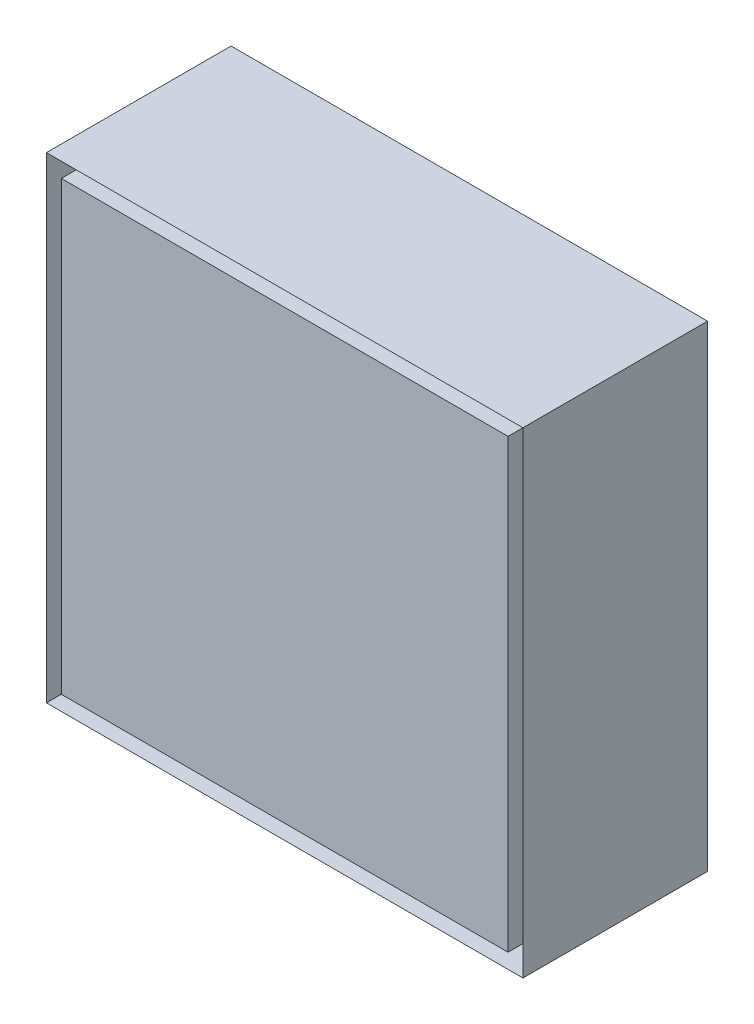
ISO-10303-21;
HEADER;
FILE_DESCRIPTION(('STEP AP214'),'2;1');
FILE_NAME('part.step','',(''),(''),'','','');
FILE_SCHEMA(('AUTOMOTIVE_DESIGN { 1 0 10303 214 1 1 1 1 }'));
ENDSEC;
DATA;
#1=APPLICATION_CONTEXT('core data for automotive mechanical design processes');
#2=APPLICATION_PROTOCOL_DEFINITION('international standard','automotive_design',2000,#1);
#3=PRODUCT_CONTEXT('',#1,'mechanical');
#4=PRODUCT('Part','Part','',(#3));
#5=PRODUCT_RELATED_PRODUCT_CATEGORY('part','',(#4));
#6=PRODUCT_DEFINITION_FORMATION('','',#4);
#7=PRODUCT_DEFINITION_CONTEXT('part definition',#1,'design');
#8=PRODUCT_DEFINITION('design','',#6,#7);
#9=PRODUCT_DEFINITION_SHAPE('','',#8);
#10=(LENGTH_UNIT() NAMED_UNIT(*) SI_UNIT(.MILLI.,.METRE.));
#11=(NAMED_UNIT(*) PLANE_ANGLE_UNIT() SI_UNIT($,.RADIAN.));
#12=(NAMED_UNIT(*) SI_UNIT($,.STERADIAN.) SOLID_ANGLE_UNIT());
#13=UNCERTAINTY_MEASURE_WITH_UNIT(LENGTH_MEASURE(1.E-05),#10,'distance_accuracy_value','');
#14=(GEOMETRIC_REPRESENTATION_CONTEXT(3) GLOBAL_UNCERTAINTY_ASSIGNED_CONTEXT((#13)) GLOBAL_UNIT_ASSIGNED_CONTEXT((#10,
#11,#12)) REPRESENTATION_CONTEXT('',''));
#15=CARTESIAN_POINT('',(0.,0.,0.));
#16=DIRECTION('',(0.,0.,1.));
#17=DIRECTION('',(1.,0.,0.));
#18=AXIS2_PLACEMENT_3D('',#15,#16,#17);
#19=CARTESIAN_POINT('',(3.16,-3.16,0.0762));
#20=DIRECTION('',(1.,0.,0.));
#21=DIRECTION('',(0.,1.,0.));
#22=AXIS2_PLACEMENT_3D('',#19,#20,#21);
#23=PLANE('',#22);
#24=DIRECTION('',(0.,0.,1.));
#25=VECTOR('',#24,1.);
#26=CARTESIAN_POINT('',(3.16,3.16,0.0862));
#27=LINE('',#26,#25);
#28=CARTESIAN_POINT('',(3.16,3.16,0.0862));
#29=VERTEX_POINT('',#28);
#30=CARTESIAN_POINT('',(3.16,3.16,0.1262));
#31=VERTEX_POINT('',#30);
#32=EDGE_CURVE('P0_E11',#29,#31,#27,.T.);
#33=ORIENTED_EDGE('',*,*,#32,.T.);
#34=DIRECTION('',(0.,1.,0.));
#35=VECTOR('',#34,1.);
#36=CARTESIAN_POINT('',(3.16,-3.16,0.1262));
#37=LINE('',#36,#35);
#38=CARTESIAN_POINT('',(3.16,-3.16,0.1262));
#39=VERTEX_POINT('',#38);
#40=EDGE_CURVE('P0_E213',#39,#31,#37,.T.);
#41=ORIENTED_EDGE('',*,*,#40,.F.);
#42=DIRECTION('',(0.,0.,1.));
#43=VECTOR('',#42,1.);
#44=CARTESIAN_POINT('',(3.16,-3.16,0.0862));
#45=LINE('',#44,#43);
#46=CARTESIAN_POINT('',(3.16,-3.16,0.0862));
#47=VERTEX_POINT('',#46);
#48=EDGE_CURVE('P0_E277',#47,#39,#45,.T.);
#49=ORIENTED_EDGE('',*,*,#48,.F.);
#50=DIRECTION('',(0.,1.,0.));
#51=VECTOR('',#50,1.);
#52=CARTESIAN_POINT('',(3.16,-3.16,0.0862));
#53=LINE('',#52,#51);
#54=EDGE_CURVE('P0_E229',#47,#29,#53,.T.);
#55=ORIENTED_EDGE('',*,*,#54,.T.);
#56=EDGE_LOOP('',(#33,#41,#49,#55));
#57=FACE_BOUND('',#56,.T.);
#58=ADVANCED_FACE('P0_F18',(#57),#23,.T.);
#59=CARTESIAN_POINT('',(3.16,3.16,0.0762));
#60=DIRECTION('',(0.,1.,0.));
#61=DIRECTION('',(1.,0.,0.));
#62=AXIS2_PLACEMENT_3D('',#59,#60,#61);
#63=PLANE('',#62);
#64=DIRECTION('',(0.,0.,1.));
#65=VECTOR('',#64,1.);
#66=CARTESIAN_POINT('',(1.56,3.16,0.0862));
#67=LINE('',#66,#65);
#68=CARTESIAN_POINT('',(1.56,3.16,0.0862));
#69=VERTEX_POINT('',#68);
#70=CARTESIAN_POINT('',(1.56,3.16,0.1262));
#71=VERTEX_POINT('',#70);
#72=EDGE_CURVE('P0_E29',#69,#71,#67,.T.);
#73=ORIENTED_EDGE('',*,*,#72,.T.);
#74=DIRECTION('',(-1.,0.,0.));
#75=VECTOR('',#74,1.);
#76=CARTESIAN_POINT('',(3.16,3.16,0.1262));
#77=LINE('',#76,#75);
#78=EDGE_CURVE('P0_E194',#31,#71,#77,.T.);
#79=ORIENTED_EDGE('',*,*,#78,.F.);
#80=ORIENTED_EDGE('',*,*,#32,.F.);
#81=DIRECTION('',(-1.,0.,0.));
#82=VECTOR('',#81,1.);
#83=CARTESIAN_POINT('',(3.16,3.16,0.0862));
#84=LINE('',#83,#82);
#85=EDGE_CURVE('P0_E203',#29,#69,#84,.T.);
#86=ORIENTED_EDGE('',*,*,#85,.T.);
#87=EDGE_LOOP('',(#73,#79,#80,#86));
#88=FACE_BOUND('',#87,.T.);
#89=ADVANCED_FACE('P0_F466',(#88),#63,.T.);
#90=CARTESIAN_POINT('',(1.56,3.16,0.0762));
#91=DIRECTION('',(-1.,0.,0.));
#92=DIRECTION('',(0.,0.,1.));
#93=AXIS2_PLACEMENT_3D('',#90,#91,#92);
#94=PLANE('',#93);
#95=DIRECTION('',(0.,0.,1.));
#96=VECTOR('',#95,1.);
#97=CARTESIAN_POINT('',(1.56,-3.16,0.0862));
#98=LINE('',#97,#96);
#99=CARTESIAN_POINT('',(1.56,-3.16,0.0862));
#100=VERTEX_POINT('',#99);
#101=CARTESIAN_POINT('',(1.56,-3.16,0.1262));
#102=VERTEX_POINT('',#101);
#103=EDGE_CURVE('P0_E274',#100,#102,#98,.T.);
#104=ORIENTED_EDGE('',*,*,#103,.T.);
#105=DIRECTION('',(0.,-1.,0.));
#106=VECTOR('',#105,1.);
#107=CARTESIAN_POINT('',(1.56,3.16,0.1262));
#108=LINE('',#107,#106);
#109=EDGE_CURVE('P0_E190',#71,#102,#108,.T.);
#110=ORIENTED_EDGE('',*,*,#109,.F.);
#111=ORIENTED_EDGE('',*,*,#72,.F.);
#112=DIRECTION('',(0.,-1.,0.));
#113=VECTOR('',#112,1.);
#114=CARTESIAN_POINT('',(1.56,3.16,0.0862));
#115=LINE('',#114,#113);
#116=EDGE_CURVE('P0_E199',#69,#100,#115,.T.);
#117=ORIENTED_EDGE('',*,*,#116,.T.);
#118=EDGE_LOOP('',(#104,#110,#111,#117));
#119=FACE_BOUND('',#118,.T.);
#120=ADVANCED_FACE('P0_F461',(#119),#94,.T.);
#121=CARTESIAN_POINT('',(1.56,-3.16,0.0762));
#122=DIRECTION('',(0.,-1.,0.));
#123=DIRECTION('',(0.,0.,-1.));
#124=AXIS2_PLACEMENT_3D('',#121,#122,#123);
#125=PLANE('',#124);
#126=ORIENTED_EDGE('',*,*,#48,.T.);
#127=DIRECTION('',(1.,0.,0.));
#128=VECTOR('',#127,1.);
#129=CARTESIAN_POINT('',(1.56,-3.16,0.1262));
#130=LINE('',#129,#128);
#131=EDGE_CURVE('P0_E185',#102,#39,#130,.T.);
#132=ORIENTED_EDGE('',*,*,#131,.F.);
#133=ORIENTED_EDGE('',*,*,#103,.F.);
#134=DIRECTION('',(1.,0.,0.));
#135=VECTOR('',#134,1.);
#136=CARTESIAN_POINT('',(1.56,-3.16,0.0862));
#137=LINE('',#136,#135);
#138=EDGE_CURVE('P0_E233',#100,#47,#137,.T.);
#139=ORIENTED_EDGE('',*,*,#138,.T.);
#140=EDGE_LOOP('',(#126,#132,#133,#139));
#141=FACE_BOUND('',#140,.T.);
#142=ADVANCED_FACE('P0_F465',(#141),#125,.T.);
#143=CARTESIAN_POINT('',(-3.16,-3.16,0.0762));
#144=DIRECTION('',(0.,-1.,0.));
#145=DIRECTION('',(0.,0.,-1.));
#146=AXIS2_PLACEMENT_3D('',#143,#144,#145);
#147=PLANE('',#146);
#148=DIRECTION('',(0.,0.,1.));
#149=VECTOR('',#148,1.);
#150=CARTESIAN_POINT('',(-1.56,-3.16,0.0862));
#151=LINE('',#150,#149);
#152=CARTESIAN_POINT('',(-1.56,-3.16,0.0862));
#153=VERTEX_POINT('',#152);
#154=CARTESIAN_POINT('',(-1.56,-3.16,0.1262));
#155=VERTEX_POINT('',#154);
#156=EDGE_CURVE('P0_E180',#153,#155,#151,.T.);
#157=ORIENTED_EDGE('',*,*,#156,.T.);
#158=DIRECTION('',(1.,0.,0.));
#159=VECTOR('',#158,1.);
#160=CARTESIAN_POINT('',(-3.16,-3.16,0.1262));
#161=LINE('',#160,#159);
#162=CARTESIAN_POINT('',(-3.16,-3.16,0.1262));
#163=VERTEX_POINT('',#162);
#164=EDGE_CURVE('P0_E173',#163,#155,#161,.T.);
#165=ORIENTED_EDGE('',*,*,#164,.F.);
#166=DIRECTION('',(0.,0.,1.));
#167=VECTOR('',#166,1.);
#168=CARTESIAN_POINT('',(-3.16,-3.16,0.0862));
#169=LINE('',#168,#167);
#170=CARTESIAN_POINT('',(-3.16,-3.16,0.0862));
#171=VERTEX_POINT('',#170);
#172=EDGE_CURVE('P0_E273',#171,#163,#169,.T.);
#173=ORIENTED_EDGE('',*,*,#172,.F.);
#174=DIRECTION('',(1.,0.,0.));
#175=VECTOR('',#174,1.);
#176=CARTESIAN_POINT('',(-3.16,-3.16,0.0862));
#177=LINE('',#176,#175);
#178=EDGE_CURVE('P0_E209',#171,#153,#177,.T.);
#179=ORIENTED_EDGE('',*,*,#178,.T.);
#180=EDGE_LOOP('',(#157,#165,#173,#179));
#181=FACE_BOUND('',#180,.T.);
#182=ADVANCED_FACE('P0_F428',(#181),#147,.T.);
#183=CARTESIAN_POINT('',(-3.16,3.16,0.0762));
#184=DIRECTION('',(-1.,0.,0.));
#185=DIRECTION('',(0.,0.,1.));
#186=AXIS2_PLACEMENT_3D('',#183,#184,#185);
#187=PLANE('',#186);
#188=ORIENTED_EDGE('',*,*,#172,.T.);
#189=DIRECTION('',(0.,-1.,0.));
#190=VECTOR('',#189,1.);
#191=CARTESIAN_POINT('',(-3.16,3.16,0.1262));
#192=LINE('',#191,#190);
#193=CARTESIAN_POINT('',(-3.16,3.16,0.1262));
#194=VERTEX_POINT('',#193);
#195=EDGE_CURVE('P0_E169',#194,#163,#192,.T.);
#196=ORIENTED_EDGE('',*,*,#195,.F.);
#197=DIRECTION('',(0.,0.,1.));
#198=VECTOR('',#197,1.);
#199=CARTESIAN_POINT('',(-3.16,3.16,0.0862));
#200=LINE('',#199,#198);
#201=CARTESIAN_POINT('',(-3.16,3.16,0.0862));
#202=VERTEX_POINT('',#201);
#203=EDGE_CURVE('P0_E269',#202,#194,#200,.T.);
#204=ORIENTED_EDGE('',*,*,#203,.F.);
#205=DIRECTION('',(0.,-1.,0.));
#206=VECTOR('',#205,1.);
#207=CARTESIAN_POINT('',(-3.16,3.16,0.0862));
#208=LINE('',#207,#206);
#209=EDGE_CURVE('P0_E218',#202,#171,#208,.T.);
#210=ORIENTED_EDGE('',*,*,#209,.T.);
#211=EDGE_LOOP('',(#188,#196,#204,#210));
#212=FACE_BOUND('',#211,.T.);
#213=ADVANCED_FACE('P0_F420',(#212),#187,.T.);
#214=CARTESIAN_POINT('',(-1.56,3.16,0.0762));
#215=DIRECTION('',(0.,1.,0.));
#216=DIRECTION('',(1.,0.,0.));
#217=AXIS2_PLACEMENT_3D('',#214,#215,#216);
#218=PLANE('',#217);
#219=ORIENTED_EDGE('',*,*,#203,.T.);
#220=DIRECTION('',(-1.,0.,0.));
#221=VECTOR('',#220,1.);
#222=CARTESIAN_POINT('',(-1.56,3.16,0.1262));
#223=LINE('',#222,#221);
#224=CARTESIAN_POINT('',(-1.56,3.16,0.1262));
#225=VERTEX_POINT('',#224);
#226=EDGE_CURVE('P0_E174',#225,#194,#223,.T.);
#227=ORIENTED_EDGE('',*,*,#226,.F.);
#228=DIRECTION('',(0.,0.,1.));
#229=VECTOR('',#228,1.);
#230=CARTESIAN_POINT('',(-1.56,3.16,0.0862));
#231=LINE('',#230,#229);
#232=CARTESIAN_POINT('',(-1.56,3.16,0.0862));
#233=VERTEX_POINT('',#232);
#234=EDGE_CURVE('P0_E181',#233,#225,#231,.T.);
#235=ORIENTED_EDGE('',*,*,#234,.F.);
#236=DIRECTION('',(-1.,0.,0.));
#237=VECTOR('',#236,1.);
#238=CARTESIAN_POINT('',(-1.56,3.16,0.0862));
#239=LINE('',#238,#237);
#240=EDGE_CURVE('P0_E222',#233,#202,#239,.T.);
#241=ORIENTED_EDGE('',*,*,#240,.T.);
#242=EDGE_LOOP('',(#219,#227,#235,#241));
#243=FACE_BOUND('',#242,.T.);
#244=ADVANCED_FACE('P0_F353',(#243),#218,.T.);
#245=CARTESIAN_POINT('',(1.47,3.26,0.0762));
#246=DIRECTION('',(-1.,0.,0.));
#247=DIRECTION('',(0.,0.,1.));
#248=AXIS2_PLACEMENT_3D('',#245,#246,#247);
#249=PLANE('',#248);
#250=DIRECTION('',(0.,0.,1.));
#251=VECTOR('',#250,1.);
#252=CARTESIAN_POINT('',(1.47,-3.26,0.0762));
#253=LINE('',#252,#251);
#254=CARTESIAN_POINT('',(1.47,-3.26,0.0762));
#255=VERTEX_POINT('',#254);
#256=CARTESIAN_POINT('',(1.47,-3.26,0.0862));
#257=VERTEX_POINT('',#256);
#258=EDGE_CURVE('P0_E189',#255,#257,#253,.T.);
#259=ORIENTED_EDGE('',*,*,#258,.T.);
#260=DIRECTION('',(0.,-1.,0.));
#261=VECTOR('',#260,1.);
#262=CARTESIAN_POINT('',(1.47,3.26,0.0862));
#263=LINE('',#262,#261);
#264=CARTESIAN_POINT('',(1.47,3.26,0.0862));
#265=VERTEX_POINT('',#264);
#266=EDGE_CURVE('P0_E315',#265,#257,#263,.T.);
#267=ORIENTED_EDGE('',*,*,#266,.F.);
#268=DIRECTION('',(0.,0.,1.));
#269=VECTOR('',#268,1.);
#270=CARTESIAN_POINT('',(1.47,3.26,0.0762));
#271=LINE('',#270,#269);
#272=CARTESIAN_POINT('',(1.47,3.26,0.0762));
#273=VERTEX_POINT('',#272);
#274=EDGE_CURVE('P0_E197',#273,#265,#271,.T.);
#275=ORIENTED_EDGE('',*,*,#274,.F.);
#276=DIRECTION('',(0.,-1.,0.));
#277=VECTOR('',#276,1.);
#278=CARTESIAN_POINT('',(1.47,3.26,0.0762));
#279=LINE('',#278,#277);
#280=EDGE_CURVE('P0_E162',#273,#255,#279,.T.);
#281=ORIENTED_EDGE('',*,*,#280,.T.);
#282=EDGE_LOOP('',(#259,#267,#275,#281));
#283=FACE_BOUND('',#282,.T.);
#284=ADVANCED_FACE('P0_F441',(#283),#249,.T.);
#285=CARTESIAN_POINT('',(3.25,3.26,0.0762));
#286=DIRECTION('',(0.,1.,0.));
#287=DIRECTION('',(1.,0.,0.));
#288=AXIS2_PLACEMENT_3D('',#285,#286,#287);
#289=PLANE('',#288);
#290=ORIENTED_EDGE('',*,*,#274,.T.);
#291=DIRECTION('',(-1.,0.,0.));
#292=VECTOR('',#291,1.);
#293=CARTESIAN_POINT('',(3.25,3.26,0.0862));
#294=LINE('',#293,#292);
#295=CARTESIAN_POINT('',(3.25,3.26,0.0862));
#296=VERTEX_POINT('',#295);
#297=EDGE_CURVE('P0_E284',#296,#265,#294,.T.);
#298=ORIENTED_EDGE('',*,*,#297,.F.);
#299=DIRECTION('',(0.,0.,1.));
#300=VECTOR('',#299,1.);
#301=CARTESIAN_POINT('',(3.25,3.26,0.0762));
#302=LINE('',#301,#300);
#303=CARTESIAN_POINT('',(3.25,3.26,0.0762));
#304=VERTEX_POINT('',#303);
#305=EDGE_CURVE('P0_E43',#304,#296,#302,.T.);
#306=ORIENTED_EDGE('',*,*,#305,.F.);
#307=DIRECTION('',(-1.,0.,0.));
#308=VECTOR('',#307,1.);
#309=CARTESIAN_POINT('',(3.25,3.26,0.0762));
#310=LINE('',#309,#308);
#311=EDGE_CURVE('P0_E258',#304,#273,#310,.T.);
#312=ORIENTED_EDGE('',*,*,#311,.T.);
#313=EDGE_LOOP('',(#290,#298,#306,#312));
#314=FACE_BOUND('',#313,.T.);
#315=ADVANCED_FACE('P0_F20',(#314),#289,.T.);
#316=CARTESIAN_POINT('',(3.25,-3.26,0.0762));
#317=DIRECTION('',(1.,0.,0.));
#318=DIRECTION('',(0.,1.,0.));
#319=AXIS2_PLACEMENT_3D('',#316,#317,#318);
#320=PLANE('',#319);
#321=ORIENTED_EDGE('',*,*,#305,.T.);
#322=DIRECTION('',(0.,1.,0.));
#323=VECTOR('',#322,1.);
#324=CARTESIAN_POINT('',(3.25,-3.26,0.0862));
#325=LINE('',#324,#323);
#326=CARTESIAN_POINT('',(3.25,-3.26,0.0862));
#327=VERTEX_POINT('',#326);
#328=EDGE_CURVE('P0_E179',#327,#296,#325,.T.);
#329=ORIENTED_EDGE('',*,*,#328,.F.);
#330=DIRECTION('',(0.,0.,1.));
#331=VECTOR('',#330,1.);
#332=CARTESIAN_POINT('',(3.25,-3.26,0.0762));
#333=LINE('',#332,#331);
#334=CARTESIAN_POINT('',(3.25,-3.26,0.0762));
#335=VERTEX_POINT('',#334);
#336=EDGE_CURVE('P0_E265',#335,#327,#333,.T.);
#337=ORIENTED_EDGE('',*,*,#336,.F.);
#338=DIRECTION('',(0.,1.,0.));
#339=VECTOR('',#338,1.);
#340=CARTESIAN_POINT('',(3.25,-3.26,0.0762));
#341=LINE('',#340,#339);
#342=EDGE_CURVE('P0_E261',#335,#304,#341,.T.);
#343=ORIENTED_EDGE('',*,*,#342,.T.);
#344=EDGE_LOOP('',(#321,#329,#337,#343));
#345=FACE_BOUND('',#344,.T.);
#346=ADVANCED_FACE('P0_F440',(#345),#320,.T.);
#347=CARTESIAN_POINT('',(-1.47,-3.26,0.0762));
#348=DIRECTION('',(1.,0.,0.));
#349=DIRECTION('',(0.,1.,0.));
#350=AXIS2_PLACEMENT_3D('',#347,#348,#349);
#351=PLANE('',#350);
#352=DIRECTION('',(0.,0.,1.));
#353=VECTOR('',#352,1.);
#354=CARTESIAN_POINT('',(-1.47,3.26,0.0762));
#355=LINE('',#354,#353);
#356=CARTESIAN_POINT('',(-1.47,3.26,0.0762));
#357=VERTEX_POINT('',#356);
#358=CARTESIAN_POINT('',(-1.47,3.26,0.0862));
#359=VERTEX_POINT('',#358);
#360=EDGE_CURVE('P0_E198',#357,#359,#355,.T.);
#361=ORIENTED_EDGE('',*,*,#360,.T.);
#362=DIRECTION('',(0.,1.,0.));
#363=VECTOR('',#362,1.);
#364=CARTESIAN_POINT('',(-1.47,-3.26,0.0862));
#365=LINE('',#364,#363);
#366=CARTESIAN_POINT('',(-1.47,-3.26,0.0862));
#367=VERTEX_POINT('',#366);
#368=EDGE_CURVE('P0_E290',#367,#359,#365,.T.);
#369=ORIENTED_EDGE('',*,*,#368,.F.);
#370=DIRECTION('',(0.,0.,1.));
#371=VECTOR('',#370,1.);
#372=CARTESIAN_POINT('',(-1.47,-3.26,0.0762));
#373=LINE('',#372,#371);
#374=CARTESIAN_POINT('',(-1.47,-3.26,0.0762));
#375=VERTEX_POINT('',#374);
#376=EDGE_CURVE('P0_E246',#375,#367,#373,.T.);
#377=ORIENTED_EDGE('',*,*,#376,.F.);
#378=DIRECTION('',(0.,1.,0.));
#379=VECTOR('',#378,1.);
#380=CARTESIAN_POINT('',(-1.47,-3.26,0.0762));
#381=LINE('',#380,#379);
#382=EDGE_CURVE('P0_E320',#375,#357,#381,.T.);
#383=ORIENTED_EDGE('',*,*,#382,.T.);
#384=EDGE_LOOP('',(#361,#369,#377,#383));
#385=FACE_BOUND('',#384,.T.);
#386=ADVANCED_FACE('P0_F554',(#385),#351,.T.);
#387=CARTESIAN_POINT('',(-1.47,3.26,0.0762));
#388=DIRECTION('',(0.,1.,0.));
#389=DIRECTION('',(1.,0.,0.));
#390=AXIS2_PLACEMENT_3D('',#387,#388,#389);
#391=PLANE('',#390);
#392=DIRECTION('',(0.,0.,1.));
#393=VECTOR('',#392,1.);
#394=CARTESIAN_POINT('',(-3.25,3.26,0.0762));
#395=LINE('',#394,#393);
#396=CARTESIAN_POINT('',(-3.25,3.26,0.0762));
#397=VERTEX_POINT('',#396);
#398=CARTESIAN_POINT('',(-3.25,3.26,0.0862));
#399=VERTEX_POINT('',#398);
#400=EDGE_CURVE('P0_E245',#397,#399,#395,.T.);
#401=ORIENTED_EDGE('',*,*,#400,.T.);
#402=DIRECTION('',(-1.,0.,0.));
#403=VECTOR('',#402,1.);
#404=CARTESIAN_POINT('',(-1.47,3.26,0.0862));
#405=LINE('',#404,#403);
#406=EDGE_CURVE('P0_E296',#359,#399,#405,.T.);
#407=ORIENTED_EDGE('',*,*,#406,.F.);
#408=ORIENTED_EDGE('',*,*,#360,.F.);
#409=DIRECTION('',(-1.,0.,0.));
#410=VECTOR('',#409,1.);
#411=CARTESIAN_POINT('',(-1.47,3.26,0.0762));
#412=LINE('',#411,#410);
#413=EDGE_CURVE('P0_E167',#357,#397,#412,.T.);
#414=ORIENTED_EDGE('',*,*,#413,.T.);
#415=EDGE_LOOP('',(#401,#407,#408,#414));
#416=FACE_BOUND('',#415,.T.);
#417=ADVANCED_FACE('P0_F584',(#416),#391,.T.);
#418=CARTESIAN_POINT('',(-3.25,3.26,0.0762));
#419=DIRECTION('',(-1.,0.,0.));
#420=DIRECTION('',(0.,0.,1.));
#421=AXIS2_PLACEMENT_3D('',#418,#419,#420);
#422=PLANE('',#421);
#423=DIRECTION('',(0.,0.,1.));
#424=VECTOR('',#423,1.);
#425=CARTESIAN_POINT('',(-3.25,-3.26,0.0762));
#426=LINE('',#425,#424);
#427=CARTESIAN_POINT('',(-3.25,-3.26,0.0762));
#428=VERTEX_POINT('',#427);
#429=CARTESIAN_POINT('',(-3.25,-3.26,0.0862));
#430=VERTEX_POINT('',#429);
#431=EDGE_CURVE('P0_E241',#428,#430,#426,.T.);
#432=ORIENTED_EDGE('',*,*,#431,.T.);
#433=DIRECTION('',(0.,-1.,0.));
#434=VECTOR('',#433,1.);
#435=CARTESIAN_POINT('',(-3.25,3.26,0.0862));
#436=LINE('',#435,#434);
#437=EDGE_CURVE('P0_E22',#399,#430,#436,.T.);
#438=ORIENTED_EDGE('',*,*,#437,.F.);
#439=ORIENTED_EDGE('',*,*,#400,.F.);
#440=DIRECTION('',(0.,-1.,0.));
#441=VECTOR('',#440,1.);
#442=CARTESIAN_POINT('',(-3.25,3.26,0.0762));
#443=LINE('',#442,#441);
#444=EDGE_CURVE('P0_E164',#397,#428,#443,.T.);
#445=ORIENTED_EDGE('',*,*,#444,.T.);
#446=EDGE_LOOP('',(#432,#438,#439,#445));
#447=FACE_BOUND('',#446,.T.);
#448=ADVANCED_FACE('P0_F565',(#447),#422,.T.);
#449=CARTESIAN_POINT('',(-3.25,-3.26,0.0762));
#450=DIRECTION('',(0.,-1.,0.));
#451=DIRECTION('',(0.,0.,-1.));
#452=AXIS2_PLACEMENT_3D('',#449,#450,#451);
#453=PLANE('',#452);
#454=ORIENTED_EDGE('',*,*,#376,.T.);
#455=DIRECTION('',(1.,0.,0.));
#456=VECTOR('',#455,1.);
#457=CARTESIAN_POINT('',(-3.25,-3.26,0.0862));
#458=LINE('',#457,#456);
#459=EDGE_CURVE('P0_E205',#430,#367,#458,.T.);
#460=ORIENTED_EDGE('',*,*,#459,.F.);
#461=ORIENTED_EDGE('',*,*,#431,.F.);
#462=DIRECTION('',(1.,0.,0.));
#463=VECTOR('',#462,1.);
#464=CARTESIAN_POINT('',(-3.25,-3.26,0.0762));
#465=LINE('',#464,#463);
#466=EDGE_CURVE('P0_E316',#428,#375,#465,.T.);
#467=ORIENTED_EDGE('',*,*,#466,.T.);
#468=EDGE_LOOP('',(#454,#460,#461,#467));
#469=FACE_BOUND('',#468,.T.);
#470=ADVANCED_FACE('P0_F500',(#469),#453,.T.);
#471=CARTESIAN_POINT('',(0.,0.,0.0762));
#472=DIRECTION('',(0.,0.,1.));
#473=DIRECTION('',(1.,0.,0.));
#474=AXIS2_PLACEMENT_3D('',#471,#472,#473);
#475=PLANE('',#474);
#476=ORIENTED_EDGE('',*,*,#280,.F.);
#477=ORIENTED_EDGE('',*,*,#311,.F.);
#478=ORIENTED_EDGE('',*,*,#342,.F.);
#479=DIRECTION('',(1.,0.,0.));
#480=VECTOR('',#479,1.);
#481=CARTESIAN_POINT('',(1.47,-3.26,0.0762));
#482=LINE('',#481,#480);
#483=EDGE_CURVE('P0_E168',#255,#335,#482,.T.);
#484=ORIENTED_EDGE('',*,*,#483,.F.);
#485=EDGE_LOOP('',(#476,#477,#478,#484));
#486=FACE_BOUND('',#485,.T.);
#487=ADVANCED_FACE('P0_F454',(#486),#475,.F.);
#488=CARTESIAN_POINT('',(0.,0.,0.0762));
#489=DIRECTION('',(0.,0.,1.));
#490=DIRECTION('',(1.,0.,0.));
#491=AXIS2_PLACEMENT_3D('',#488,#489,#490);
#492=PLANE('',#491);
#493=ORIENTED_EDGE('',*,*,#444,.F.);
#494=ORIENTED_EDGE('',*,*,#413,.F.);
#495=ORIENTED_EDGE('',*,*,#382,.F.);
#496=ORIENTED_EDGE('',*,*,#466,.F.);
#497=EDGE_LOOP('',(#493,#494,#495,#496));
#498=FACE_BOUND('',#497,.T.);
#499=ADVANCED_FACE('P0_F449',(#498),#492,.F.);
#500=CARTESIAN_POINT('',(1.47,-3.26,0.0762));
#501=DIRECTION('',(0.,-1.,0.));
#502=DIRECTION('',(0.,0.,-1.));
#503=AXIS2_PLACEMENT_3D('',#500,#501,#502);
#504=PLANE('',#503);
#505=ORIENTED_EDGE('',*,*,#336,.T.);
#506=DIRECTION('',(1.,0.,0.));
#507=VECTOR('',#506,1.);
#508=CARTESIAN_POINT('',(1.47,-3.26,0.0862));
#509=LINE('',#508,#507);
#510=EDGE_CURVE('P0_E204',#257,#327,#509,.T.);
#511=ORIENTED_EDGE('',*,*,#510,.F.);
#512=ORIENTED_EDGE('',*,*,#258,.F.);
#513=ORIENTED_EDGE('',*,*,#483,.T.);
#514=EDGE_LOOP('',(#505,#511,#512,#513));
#515=FACE_BOUND('',#514,.T.);
#516=ADVANCED_FACE('P0_F453',(#515),#504,.T.);
#517=CARTESIAN_POINT('',(0.,0.,0.0862));
#518=DIRECTION('',(0.,0.,1.));
#519=DIRECTION('',(1.,0.,0.));
#520=AXIS2_PLACEMENT_3D('',#517,#518,#519);
#521=PLANE('',#520);
#522=ORIENTED_EDGE('',*,*,#178,.F.);
#523=ORIENTED_EDGE('',*,*,#209,.F.);
#524=ORIENTED_EDGE('',*,*,#240,.F.);
#525=DIRECTION('',(0.,1.,0.));
#526=VECTOR('',#525,1.);
#527=CARTESIAN_POINT('',(-1.56,-3.16,0.0862));
#528=LINE('',#527,#526);
#529=EDGE_CURVE('P0_E175',#153,#233,#528,.T.);
#530=ORIENTED_EDGE('',*,*,#529,.F.);
#531=EDGE_LOOP('',(#522,#523,#524,#530));
#532=FACE_BOUND('',#531,.T.);
#533=ORIENTED_EDGE('',*,*,#368,.T.);
#534=ORIENTED_EDGE('',*,*,#406,.T.);
#535=ORIENTED_EDGE('',*,*,#437,.T.);
#536=ORIENTED_EDGE('',*,*,#459,.T.);
#537=EDGE_LOOP('',(#533,#534,#535,#536));
#538=FACE_BOUND('',#537,.T.);
#539=ADVANCED_FACE('P0_F425',(#532,#538),#521,.T.);
#540=CARTESIAN_POINT('',(0.,0.,0.0862));
#541=DIRECTION('',(0.,0.,1.));
#542=DIRECTION('',(1.,0.,0.));
#543=AXIS2_PLACEMENT_3D('',#540,#541,#542);
#544=PLANE('',#543);
#545=ORIENTED_EDGE('',*,*,#116,.F.);
#546=ORIENTED_EDGE('',*,*,#85,.F.);
#547=ORIENTED_EDGE('',*,*,#54,.F.);
#548=ORIENTED_EDGE('',*,*,#138,.F.);
#549=EDGE_LOOP('',(#545,#546,#547,#548));
#550=FACE_BOUND('',#549,.T.);
#551=ORIENTED_EDGE('',*,*,#328,.T.);
#552=ORIENTED_EDGE('',*,*,#297,.T.);
#553=ORIENTED_EDGE('',*,*,#266,.T.);
#554=ORIENTED_EDGE('',*,*,#510,.T.);
#555=EDGE_LOOP('',(#551,#552,#553,#554));
#556=FACE_BOUND('',#555,.T.);
#557=ADVANCED_FACE('P0_F531',(#550,#556),#544,.T.);
#558=CARTESIAN_POINT('',(-1.56,-3.16,0.0762));
#559=DIRECTION('',(1.,0.,0.));
#560=DIRECTION('',(0.,1.,0.));
#561=AXIS2_PLACEMENT_3D('',#558,#559,#560);
#562=PLANE('',#561);
#563=ORIENTED_EDGE('',*,*,#234,.T.);
#564=DIRECTION('',(0.,1.,0.));
#565=VECTOR('',#564,1.);
#566=CARTESIAN_POINT('',(-1.56,-3.16,0.1262));
#567=LINE('',#566,#565);
#568=EDGE_CURVE('P0_E217',#155,#225,#567,.T.);
#569=ORIENTED_EDGE('',*,*,#568,.F.);
#570=ORIENTED_EDGE('',*,*,#156,.F.);
#571=ORIENTED_EDGE('',*,*,#529,.T.);
#572=EDGE_LOOP('',(#563,#569,#570,#571));
#573=FACE_BOUND('',#572,.T.);
#574=ADVANCED_FACE('P0_F522',(#573),#562,.T.);
#575=CARTESIAN_POINT('',(0.,3.75,0.0762));
#576=DIRECTION('',(0.,1.,0.));
#577=DIRECTION('',(1.,0.,0.));
#578=AXIS2_PLACEMENT_3D('',#575,#576,#577);
#579=PLANE('',#578);
#580=DIRECTION('',(-1.,0.,0.));
#581=VECTOR('',#580,1.);
#582=CARTESIAN_POINT('',(3.75,3.75,0.1262));
#583=LINE('',#582,#581);
#584=CARTESIAN_POINT('',(3.75,3.75,0.1262));
#585=VERTEX_POINT('',#584);
#586=CARTESIAN_POINT('',(-3.75,3.75,0.1262));
#587=VERTEX_POINT('',#586);
#588=EDGE_CURVE('P0_E234',#585,#587,#583,.T.);
#589=ORIENTED_EDGE('',*,*,#588,.T.);
#590=DIRECTION('',(0.,0.,1.));
#591=VECTOR('',#590,1.);
#592=CARTESIAN_POINT('',(-3.75,3.75,0.1262));
#593=LINE('',#592,#591);
#594=CARTESIAN_POINT('',(-3.75,3.75,3.1762));
#595=VERTEX_POINT('',#594);
#596=EDGE_CURVE('P0_E135',#587,#595,#593,.T.);
#597=ORIENTED_EDGE('',*,*,#596,.T.);
#598=DIRECTION('',(1.,0.,0.));
#599=VECTOR('',#598,1.);
#600=CARTESIAN_POINT('',(-3.75,3.75,3.1762));
#601=LINE('',#600,#599);
#602=CARTESIAN_POINT('',(3.75,3.75,3.1762));
#603=VERTEX_POINT('',#602);
#604=EDGE_CURVE('P0_E131',#595,#603,#601,.T.);
#605=ORIENTED_EDGE('',*,*,#604,.T.);
#606=DIRECTION('',(0.,0.,-1.));
#607=VECTOR('',#606,1.);
#608=CARTESIAN_POINT('',(3.75,3.75,3.1762));
#609=LINE('',#608,#607);
#610=EDGE_CURVE('P0_E336',#603,#585,#609,.T.);
#611=ORIENTED_EDGE('',*,*,#610,.T.);
#612=EDGE_LOOP('',(#589,#597,#605,#611));
#613=FACE_BOUND('',#612,.T.);
#614=ADVANCED_FACE('P0_F518',(#613),#579,.T.);
#615=CARTESIAN_POINT('',(3.75,-3.75,0.1262));
#616=DIRECTION('',(0.,0.,-1.));
#617=DIRECTION('',(0.,-1.,0.));
#618=AXIS2_PLACEMENT_3D('',#615,#616,#617);
#619=PLANE('',#618);
#620=ORIENTED_EDGE('',*,*,#40,.T.);
#621=ORIENTED_EDGE('',*,*,#78,.T.);
#622=ORIENTED_EDGE('',*,*,#109,.T.);
#623=ORIENTED_EDGE('',*,*,#131,.T.);
#624=EDGE_LOOP('',(#620,#621,#622,#623));
#625=FACE_BOUND('',#624,.T.);
#626=ORIENTED_EDGE('',*,*,#226,.T.);
#627=ORIENTED_EDGE('',*,*,#195,.T.);
#628=ORIENTED_EDGE('',*,*,#164,.T.);
#629=ORIENTED_EDGE('',*,*,#568,.T.);
#630=EDGE_LOOP('',(#626,#627,#628,#629));
#631=FACE_BOUND('',#630,.T.);
#632=DIRECTION('',(0.,1.,0.));
#633=VECTOR('',#632,1.);
#634=CARTESIAN_POINT('',(-3.75,-3.75,0.1262));
#635=LINE('',#634,#633);
#636=CARTESIAN_POINT('',(-3.75,-3.75,0.1262));
#637=VERTEX_POINT('',#636);
#638=EDGE_CURVE('P0_E142',#637,#587,#635,.T.);
#639=ORIENTED_EDGE('',*,*,#638,.T.);
#640=ORIENTED_EDGE('',*,*,#588,.F.);
#641=DIRECTION('',(0.,1.,0.));
#642=VECTOR('',#641,1.);
#643=CARTESIAN_POINT('',(3.75,-3.75,0.1262));
#644=LINE('',#643,#642);
#645=CARTESIAN_POINT('',(3.75,-3.75,0.1262));
#646=VERTEX_POINT('',#645);
#647=EDGE_CURVE('P0_E228',#646,#585,#644,.T.);
#648=ORIENTED_EDGE('',*,*,#647,.F.);
#649=DIRECTION('',(-1.,0.,0.));
#650=VECTOR('',#649,1.);
#651=CARTESIAN_POINT('',(3.75,-3.75,0.1262));
#652=LINE('',#651,#650);
#653=EDGE_CURVE('P0_E147',#646,#637,#652,.T.);
#654=ORIENTED_EDGE('',*,*,#653,.T.);
#655=EDGE_LOOP('',(#639,#640,#648,#654));
#656=FACE_BOUND('',#655,.T.);
#657=ADVANCED_FACE('P0_F344',(#625,#631,#656),#619,.T.);
#658=CARTESIAN_POINT('',(-3.75,-3.75,0.1262));
#659=DIRECTION('',(-1.,0.,0.));
#660=DIRECTION('',(0.,0.,1.));
#661=AXIS2_PLACEMENT_3D('',#658,#659,#660);
#662=PLANE('',#661);
#663=DIRECTION('',(0.,1.,0.));
#664=VECTOR('',#663,1.);
#665=CARTESIAN_POINT('',(-3.75,-3.75,3.1762));
#666=LINE('',#665,#664);
#667=CARTESIAN_POINT('',(-3.75,-3.75,3.1762));
#668=VERTEX_POINT('',#667);
#669=EDGE_CURVE('P0_E125',#668,#595,#666,.T.);
#670=ORIENTED_EDGE('',*,*,#669,.T.);
#671=ORIENTED_EDGE('',*,*,#596,.F.);
#672=ORIENTED_EDGE('',*,*,#638,.F.);
#673=DIRECTION('',(0.,0.,1.));
#674=VECTOR('',#673,1.);
#675=CARTESIAN_POINT('',(-3.75,-3.75,0.1262));
#676=LINE('',#675,#674);
#677=EDGE_CURVE('P0_E139',#637,#668,#676,.T.);
#678=ORIENTED_EDGE('',*,*,#677,.T.);
#679=EDGE_LOOP('',(#670,#671,#672,#678));
#680=FACE_BOUND('',#679,.T.);
#681=ADVANCED_FACE('P0_F140',(#680),#662,.T.);
#682=CARTESIAN_POINT('',(-3.75,-3.75,3.1762));
#683=DIRECTION('',(0.,0.,1.));
#684=DIRECTION('',(1.,0.,0.));
#685=AXIS2_PLACEMENT_3D('',#682,#683,#684);
#686=PLANE('',#685);
#687=DIRECTION('',(0.,1.,0.));
#688=VECTOR('',#687,1.);
#689=CARTESIAN_POINT('',(3.75,-3.75,3.1762));
#690=LINE('',#689,#688);
#691=CARTESIAN_POINT('',(3.75,-3.75,3.1762));
#692=VERTEX_POINT('',#691);
#693=EDGE_CURVE('P0_E212',#692,#603,#690,.T.);
#694=ORIENTED_EDGE('',*,*,#693,.T.);
#695=ORIENTED_EDGE('',*,*,#604,.F.);
#696=ORIENTED_EDGE('',*,*,#669,.F.);
#697=DIRECTION('',(1.,0.,0.));
#698=VECTOR('',#697,1.);
#699=CARTESIAN_POINT('',(-3.75,-3.75,3.1762));
#700=LINE('',#699,#698);
#701=EDGE_CURVE('P0_E130',#668,#692,#700,.T.);
#702=ORIENTED_EDGE('',*,*,#701,.T.);
#703=EDGE_LOOP('',(#694,#695,#696,#702));
#704=FACE_BOUND('',#703,.T.);
#705=ADVANCED_FACE('P0_F128',(#704),#686,.T.);
#706=CARTESIAN_POINT('',(3.75,-3.75,3.1762));
#707=DIRECTION('',(1.,0.,0.));
#708=DIRECTION('',(0.,1.,0.));
#709=AXIS2_PLACEMENT_3D('',#706,#707,#708);
#710=PLANE('',#709);
#711=ORIENTED_EDGE('',*,*,#647,.T.);
#712=ORIENTED_EDGE('',*,*,#610,.F.);
#713=ORIENTED_EDGE('',*,*,#693,.F.);
#714=DIRECTION('',(0.,0.,-1.));
#715=VECTOR('',#714,1.);
#716=CARTESIAN_POINT('',(3.75,-3.75,3.1762));
#717=LINE('',#716,#715);
#718=EDGE_CURVE('P0_E152',#692,#646,#717,.T.);
#719=ORIENTED_EDGE('',*,*,#718,.T.);
#720=EDGE_LOOP('',(#711,#712,#713,#719));
#721=FACE_BOUND('',#720,.T.);
#722=ADVANCED_FACE('P0_F489',(#721),#710,.T.);
#723=CARTESIAN_POINT('',(0.,-3.75,0.0762));
#724=DIRECTION('',(0.,1.,0.));
#725=DIRECTION('',(1.,0.,0.));
#726=AXIS2_PLACEMENT_3D('',#723,#724,#725);
#727=PLANE('',#726);
#728=ORIENTED_EDGE('',*,*,#701,.F.);
#729=ORIENTED_EDGE('',*,*,#677,.F.);
#730=ORIENTED_EDGE('',*,*,#653,.F.);
#731=ORIENTED_EDGE('',*,*,#718,.F.);
#732=EDGE_LOOP('',(#728,#729,#730,#731));
#733=FACE_BOUND('',#732,.T.);
#734=ADVANCED_FACE('P0_F150',(#733),#727,.F.);
#735=CLOSED_SHELL('',(#58,#89,#120,#142,#182,#213,#244,#284,#315,#346,#386,#417,#448,#470,#487,
#499,#516,#539,#557,#574,#614,#657,#681,#705,#722,#734));
#736=MANIFOLD_SOLID_BREP('P0_B1',#735);
#737=CARTESIAN_POINT('',(-4.,-4.,0.0762));
#738=DIRECTION('',(0.,-1.,0.));
#739=DIRECTION('',(0.,0.,-1.));
#740=AXIS2_PLACEMENT_3D('',#737,#738,#739);
#741=PLANE('',#740);
#742=CARTESIAN_POINT('',(-4.,-4.,3.1762));
#743=DIRECTION('',(0.,0.,-1.));
#744=VECTOR('',#743,1.);
#745=LINE('',#742,#744);
#746=CARTESIAN_POINT('',(-4.,-4.,3.1762));
#747=VERTEX_POINT('',#746);
#748=CARTESIAN_POINT('',(-4.,-4.,0.0762));
#749=VERTEX_POINT('',#748);
#750=EDGE_CURVE('P1_E29',#747,#749,#745,.T.);
#751=ORIENTED_EDGE('',*,*,#750,.T.);
#752=CARTESIAN_POINT('',(-4.,-4.,0.0762));
#753=DIRECTION('',(1.,0.,0.));
#754=VECTOR('',#753,1.);
#755=LINE('',#752,#754);
#756=CARTESIAN_POINT('',(4.,-4.,0.0762));
#757=VERTEX_POINT('',#756);
#758=EDGE_CURVE('P1_E11',#749,#757,#755,.T.);
#759=ORIENTED_EDGE('',*,*,#758,.T.);
#760=CARTESIAN_POINT('',(4.,-4.,0.0762));
#761=DIRECTION('',(0.,0.,1.));
#762=VECTOR('',#761,1.);
#763=LINE('',#760,#762);
#764=CARTESIAN_POINT('',(4.,-4.,3.1762));
#765=VERTEX_POINT('',#764);
#766=EDGE_CURVE('P1_E79',#757,#765,#763,.T.);
#767=ORIENTED_EDGE('',*,*,#766,.T.);
#768=CARTESIAN_POINT('',(4.,-4.,3.1762));
#769=DIRECTION('',(-1.,0.,0.));
#770=VECTOR('',#769,1.);
#771=LINE('',#768,#770);
#772=EDGE_CURVE('P1_E122',#765,#747,#771,.T.);
#773=ORIENTED_EDGE('',*,*,#772,.T.);
#774=EDGE_LOOP('',(#751,#759,#767,#773));
#775=FACE_BOUND('',#774,.T.);
#776=ADVANCED_FACE('P1_F18',(#775),#741,.T.);
#777=CARTESIAN_POINT('',(-4.,4.,0.0762));
#778=DIRECTION('',(-1.,0.,0.));
#779=DIRECTION('',(0.,0.,1.));
#780=AXIS2_PLACEMENT_3D('',#777,#778,#779);
#781=PLANE('',#780);
#782=CARTESIAN_POINT('',(-4.,4.,3.1762));
#783=DIRECTION('',(0.,0.,-1.));
#784=VECTOR('',#783,1.);
#785=LINE('',#782,#784);
#786=CARTESIAN_POINT('',(-4.,4.,3.1762));
#787=VERTEX_POINT('',#786);
#788=CARTESIAN_POINT('',(-4.,4.,0.0762));
#789=VERTEX_POINT('',#788);
#790=EDGE_CURVE('P1_E190',#787,#789,#785,.T.);
#791=ORIENTED_EDGE('',*,*,#790,.T.);
#792=CARTESIAN_POINT('',(-4.,4.,0.0762));
#793=DIRECTION('',(0.,-1.,0.));
#794=VECTOR('',#793,1.);
#795=LINE('',#792,#794);
#796=EDGE_CURVE('P1_E37',#789,#749,#795,.T.);
#797=ORIENTED_EDGE('',*,*,#796,.T.);
#798=ORIENTED_EDGE('',*,*,#750,.F.);
#799=CARTESIAN_POINT('',(-4.,-4.,3.1762));
#800=DIRECTION('',(0.,1.,0.));
#801=VECTOR('',#800,1.);
#802=LINE('',#799,#801);
#803=EDGE_CURVE('P1_E82',#747,#787,#802,.T.);
#804=ORIENTED_EDGE('',*,*,#803,.T.);
#805=EDGE_LOOP('',(#791,#797,#798,#804));
#806=FACE_BOUND('',#805,.T.);
#807=ADVANCED_FACE('P1_F99',(#806),#781,.T.);
#808=CARTESIAN_POINT('',(4.,-4.,0.0762));
#809=DIRECTION('',(1.,0.,0.));
#810=DIRECTION('',(0.,1.,0.));
#811=AXIS2_PLACEMENT_3D('',#808,#809,#810);
#812=PLANE('',#811);
#813=ORIENTED_EDGE('',*,*,#766,.F.);
#814=CARTESIAN_POINT('',(4.,-4.,0.0762));
#815=DIRECTION('',(0.,1.,0.));
#816=VECTOR('',#815,1.);
#817=LINE('',#814,#816);
#818=CARTESIAN_POINT('',(4.,4.,0.0762));
#819=VERTEX_POINT('',#818);
#820=EDGE_CURVE('P1_E75',#757,#819,#817,.T.);
#821=ORIENTED_EDGE('',*,*,#820,.T.);
#822=CARTESIAN_POINT('',(4.,4.,0.0762));
#823=DIRECTION('',(0.,0.,1.));
#824=VECTOR('',#823,1.);
#825=LINE('',#822,#824);
#826=CARTESIAN_POINT('',(4.,4.,3.1762));
#827=VERTEX_POINT('',#826);
#828=EDGE_CURVE('P1_E61',#819,#827,#825,.T.);
#829=ORIENTED_EDGE('',*,*,#828,.T.);
#830=CARTESIAN_POINT('',(4.,4.,3.1762));
#831=DIRECTION('',(0.,-1.,0.));
#832=VECTOR('',#831,1.);
#833=LINE('',#830,#832);
#834=EDGE_CURVE('P1_E70',#827,#765,#833,.T.);
#835=ORIENTED_EDGE('',*,*,#834,.T.);
#836=EDGE_LOOP('',(#813,#821,#829,#835));
#837=FACE_BOUND('',#836,.T.);
#838=ADVANCED_FACE('P1_F77',(#837),#812,.T.);
#839=CARTESIAN_POINT('',(4.,4.,0.0762));
#840=DIRECTION('',(0.,1.,0.));
#841=DIRECTION('',(1.,0.,0.));
#842=AXIS2_PLACEMENT_3D('',#839,#840,#841);
#843=PLANE('',#842);
#844=ORIENTED_EDGE('',*,*,#828,.F.);
#845=CARTESIAN_POINT('',(4.,4.,0.0762));
#846=DIRECTION('',(-1.,0.,0.));
#847=VECTOR('',#846,1.);
#848=LINE('',#845,#847);
#849=EDGE_CURVE('P1_E64',#819,#789,#848,.T.);
#850=ORIENTED_EDGE('',*,*,#849,.T.);
#851=ORIENTED_EDGE('',*,*,#790,.F.);
#852=CARTESIAN_POINT('',(-4.,4.,3.1762));
#853=DIRECTION('',(1.,0.,0.));
#854=VECTOR('',#853,1.);
#855=LINE('',#852,#854);
#856=EDGE_CURVE('P1_E58',#787,#827,#855,.T.);
#857=ORIENTED_EDGE('',*,*,#856,.T.);
#858=EDGE_LOOP('',(#844,#850,#851,#857));
#859=FACE_BOUND('',#858,.T.);
#860=ADVANCED_FACE('P1_F19',(#859),#843,.T.);
#861=OPEN_SHELL('',(#776,#807,#838,#860));
#862=SHELL_BASED_SURFACE_MODEL('P1_B1',(#861));
#863=ADVANCED_BREP_SHAPE_REPRESENTATION('',(#18,#736),#14);
#864=MANIFOLD_SURFACE_SHAPE_REPRESENTATION('',(#18,#862),#14);
#865=SHAPE_REPRESENTATION('',(#18),#14);
#866=SHAPE_DEFINITION_REPRESENTATION(#9,#865);
#867=SHAPE_REPRESENTATION_RELATIONSHIP('','',#865,#863);
#868=SHAPE_REPRESENTATION_RELATIONSHIP('','',#865,#864);
ENDSEC;
END-ISO-10303-21;
